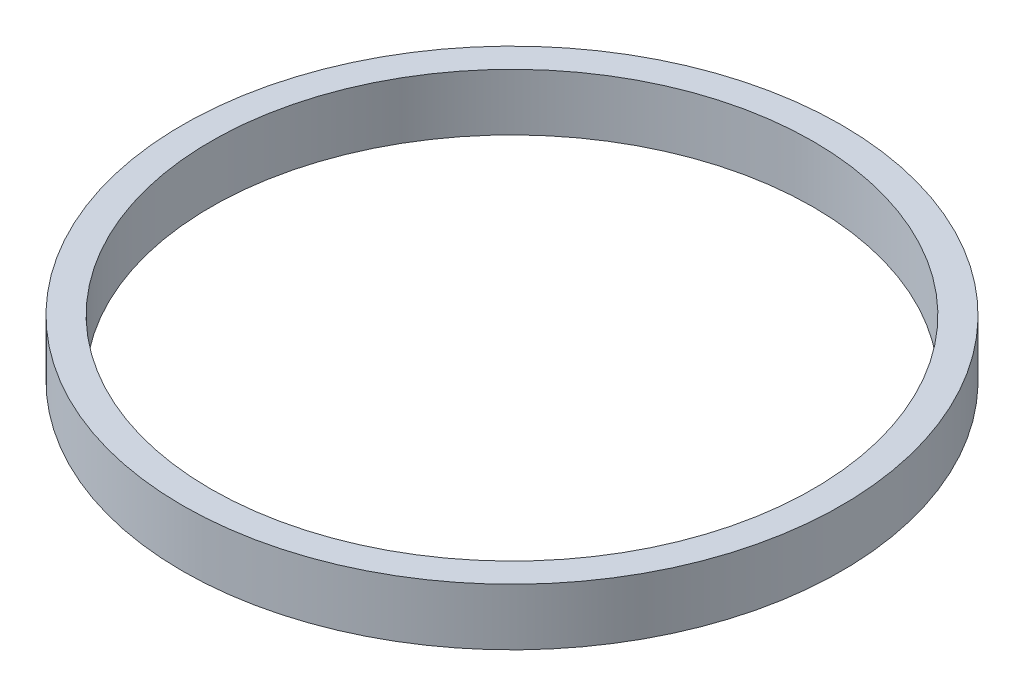
ISO-10303-21;
HEADER;
FILE_DESCRIPTION(('STEP AP214'),'2;1');
FILE_NAME('part.step','',(''),(''),'','','');
FILE_SCHEMA(('AUTOMOTIVE_DESIGN { 1 0 10303 214 1 1 1 1 }'));
ENDSEC;
DATA;
#1=APPLICATION_CONTEXT('core data for automotive mechanical design processes');
#2=APPLICATION_PROTOCOL_DEFINITION('international standard','automotive_design',2000,#1);
#3=PRODUCT_CONTEXT('',#1,'mechanical');
#4=PRODUCT('Part','Part','',(#3));
#5=PRODUCT_RELATED_PRODUCT_CATEGORY('part','',(#4));
#6=PRODUCT_DEFINITION_FORMATION('','',#4);
#7=PRODUCT_DEFINITION_CONTEXT('part definition',#1,'design');
#8=PRODUCT_DEFINITION('design','',#6,#7);
#9=PRODUCT_DEFINITION_SHAPE('','',#8);
#10=(LENGTH_UNIT() NAMED_UNIT(*) SI_UNIT(.MILLI.,.METRE.));
#11=(NAMED_UNIT(*) PLANE_ANGLE_UNIT() SI_UNIT($,.RADIAN.));
#12=(NAMED_UNIT(*) SI_UNIT($,.STERADIAN.) SOLID_ANGLE_UNIT());
#13=UNCERTAINTY_MEASURE_WITH_UNIT(LENGTH_MEASURE(1.E-05),#10,'distance_accuracy_value','');
#14=(GEOMETRIC_REPRESENTATION_CONTEXT(3) GLOBAL_UNCERTAINTY_ASSIGNED_CONTEXT((#13)) GLOBAL_UNIT_ASSIGNED_CONTEXT((#10,
#11,#12)) REPRESENTATION_CONTEXT('',''));
#15=CARTESIAN_POINT('',(0.,0.,0.));
#16=DIRECTION('',(0.,0.,1.));
#17=DIRECTION('',(1.,0.,0.));
#18=AXIS2_PLACEMENT_3D('',#15,#16,#17);
#19=CARTESIAN_POINT('',(0.,5.,0.));
#20=DIRECTION('',(0.,1.,0.));
#21=DIRECTION('',(0.,0.,1.));
#22=AXIS2_PLACEMENT_3D('',#19,#20,#21);
#23=PLANE('',#22);
#24=CARTESIAN_POINT('',(0.,5.,0.));
#25=DIRECTION('',(0.,1.,0.));
#26=DIRECTION('',(0.,0.,1.));
#27=AXIS2_PLACEMENT_3D('',#24,#25,#26);
#28=CIRCLE('',#27,29.);
#29=CARTESIAN_POINT('',(0.,5.,29.));
#30=VERTEX_POINT('',#29);
#31=EDGE_CURVE('E10',#30,#30,#28,.T.);
#32=ORIENTED_EDGE('',*,*,#31,.T.);
#33=EDGE_LOOP('',(#32));
#34=FACE_BOUND('',#33,.T.);
#35=CARTESIAN_POINT('',(0.,5.,0.));
#36=DIRECTION('',(0.,1.,0.));
#37=DIRECTION('',(0.,0.,1.));
#38=AXIS2_PLACEMENT_3D('',#35,#36,#37);
#39=CIRCLE('',#38,26.5);
#40=CARTESIAN_POINT('',(0.,5.,26.5));
#41=VERTEX_POINT('',#40);
#42=EDGE_CURVE('E46',#41,#41,#39,.T.);
#43=ORIENTED_EDGE('',*,*,#42,.F.);
#44=EDGE_LOOP('',(#43));
#45=FACE_BOUND('',#44,.T.);
#46=ADVANCED_FACE('F35',(#34,#45),#23,.T.);
#47=CARTESIAN_POINT('',(0.,0.,0.));
#48=DIRECTION('',(0.,1.,0.));
#49=DIRECTION('',(0.,0.,1.));
#50=AXIS2_PLACEMENT_3D('',#47,#48,#49);
#51=PLANE('',#50);
#52=CARTESIAN_POINT('',(0.,0.,0.));
#53=DIRECTION('',(0.,1.,0.));
#54=DIRECTION('',(0.,0.,1.));
#55=AXIS2_PLACEMENT_3D('',#52,#53,#54);
#56=CIRCLE('',#55,29.);
#57=CARTESIAN_POINT('',(0.,0.,29.));
#58=VERTEX_POINT('',#57);
#59=EDGE_CURVE('E39',#58,#58,#56,.T.);
#60=ORIENTED_EDGE('',*,*,#59,.F.);
#61=EDGE_LOOP('',(#60));
#62=FACE_BOUND('',#61,.T.);
#63=CARTESIAN_POINT('',(0.,0.,0.));
#64=DIRECTION('',(0.,1.,0.));
#65=DIRECTION('',(0.,0.,1.));
#66=AXIS2_PLACEMENT_3D('',#63,#64,#65);
#67=CIRCLE('',#66,26.5);
#68=CARTESIAN_POINT('',(0.,0.,26.5));
#69=VERTEX_POINT('',#68);
#70=EDGE_CURVE('E48',#69,#69,#67,.T.);
#71=ORIENTED_EDGE('',*,*,#70,.T.);
#72=EDGE_LOOP('',(#71));
#73=FACE_BOUND('',#72,.T.);
#74=ADVANCED_FACE('F58',(#62,#73),#51,.F.);
#75=CARTESIAN_POINT('',(0.,5.,0.));
#76=DIRECTION('',(0.,-1.,0.));
#77=DIRECTION('',(0.,0.,-1.));
#78=AXIS2_PLACEMENT_3D('',#75,#76,#77);
#79=CYLINDRICAL_SURFACE('',#78,29.);
#80=ORIENTED_EDGE('',*,*,#31,.F.);
#81=EDGE_LOOP('',(#80));
#82=FACE_BOUND('',#81,.T.);
#83=ORIENTED_EDGE('',*,*,#59,.T.);
#84=EDGE_LOOP('',(#83));
#85=FACE_BOUND('',#84,.T.);
#86=ADVANCED_FACE('F37',(#82,#85),#79,.T.);
#87=CARTESIAN_POINT('',(0.,5.,0.));
#88=DIRECTION('',(0.,-1.,0.));
#89=DIRECTION('',(0.,0.,-1.));
#90=AXIS2_PLACEMENT_3D('',#87,#88,#89);
#91=CYLINDRICAL_SURFACE('',#90,26.5);
#92=ORIENTED_EDGE('',*,*,#42,.T.);
#93=EDGE_LOOP('',(#92));
#94=FACE_BOUND('',#93,.T.);
#95=ORIENTED_EDGE('',*,*,#70,.F.);
#96=EDGE_LOOP('',(#95));
#97=FACE_BOUND('',#96,.T.);
#98=ADVANCED_FACE('F54',(#94,#97),#91,.F.);
#99=CLOSED_SHELL('',(#46,#74,#86,#98));
#100=MANIFOLD_SOLID_BREP('B2',#99);
#101=ADVANCED_BREP_SHAPE_REPRESENTATION('',(#18,#100),#14);
#102=SHAPE_DEFINITION_REPRESENTATION(#9,#101);
ENDSEC;
END-ISO-10303-21;
